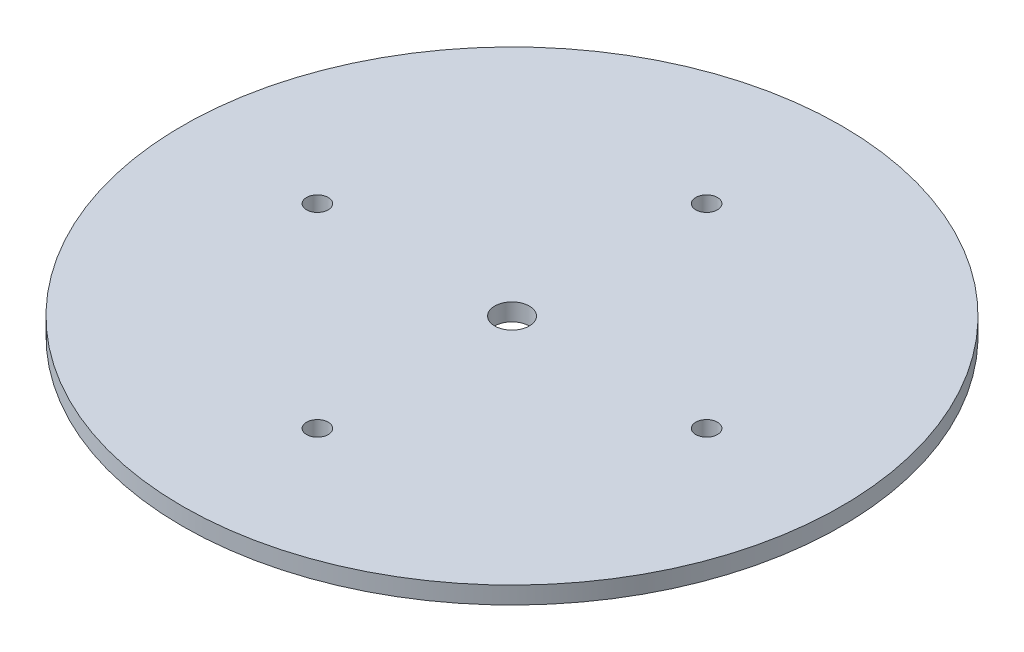
ISO-10303-21;
HEADER;
FILE_DESCRIPTION(('STEP AP214'),'2;1');
FILE_NAME('part.step','',(''),(''),'','','');
FILE_SCHEMA(('AUTOMOTIVE_DESIGN { 1 0 10303 214 1 1 1 1 }'));
ENDSEC;
DATA;
#1=APPLICATION_CONTEXT('core data for automotive mechanical design processes');
#2=APPLICATION_PROTOCOL_DEFINITION('international standard','automotive_design',2000,#1);
#3=PRODUCT_CONTEXT('',#1,'mechanical');
#4=PRODUCT('Part','Part','',(#3));
#5=PRODUCT_RELATED_PRODUCT_CATEGORY('part','',(#4));
#6=PRODUCT_DEFINITION_FORMATION('','',#4);
#7=PRODUCT_DEFINITION_CONTEXT('part definition',#1,'design');
#8=PRODUCT_DEFINITION('design','',#6,#7);
#9=PRODUCT_DEFINITION_SHAPE('','',#8);
#10=(LENGTH_UNIT() NAMED_UNIT(*) SI_UNIT(.MILLI.,.METRE.));
#11=(NAMED_UNIT(*) PLANE_ANGLE_UNIT() SI_UNIT($,.RADIAN.));
#12=(NAMED_UNIT(*) SI_UNIT($,.STERADIAN.) SOLID_ANGLE_UNIT());
#13=UNCERTAINTY_MEASURE_WITH_UNIT(LENGTH_MEASURE(1.E-05),#10,'distance_accuracy_value','');
#14=(GEOMETRIC_REPRESENTATION_CONTEXT(3) GLOBAL_UNCERTAINTY_ASSIGNED_CONTEXT((#13)) GLOBAL_UNIT_ASSIGNED_CONTEXT((#10,
#11,#12)) REPRESENTATION_CONTEXT('',''));
#15=CARTESIAN_POINT('',(0.,0.,0.));
#16=DIRECTION('',(0.,0.,1.));
#17=DIRECTION('',(1.,0.,0.));
#18=AXIS2_PLACEMENT_3D('',#15,#16,#17);
#19=CARTESIAN_POINT('',(0.,4.,45.));
#20=DIRECTION('',(0.,-1.,0.));
#21=DIRECTION('',(0.,0.,-1.));
#22=AXIS2_PLACEMENT_3D('',#19,#20,#21);
#23=CYLINDRICAL_SURFACE('',#22,2.5);
#24=CARTESIAN_POINT('',(0.,4.,45.));
#25=DIRECTION('',(0.,1.,0.));
#26=DIRECTION('',(0.,0.,1.));
#27=AXIS2_PLACEMENT_3D('',#24,#25,#26);
#28=CIRCLE('',#27,2.5);
#29=CARTESIAN_POINT('',(0.,4.,47.5));
#30=VERTEX_POINT('',#29);
#31=EDGE_CURVE('E43',#30,#30,#28,.T.);
#32=ORIENTED_EDGE('',*,*,#31,.T.);
#33=EDGE_LOOP('',(#32));
#34=FACE_BOUND('',#33,.T.);
#35=CARTESIAN_POINT('',(0.,0.,45.));
#36=DIRECTION('',(0.,1.,0.));
#37=DIRECTION('',(0.,0.,1.));
#38=AXIS2_PLACEMENT_3D('',#35,#36,#37);
#39=CIRCLE('',#38,2.5);
#40=CARTESIAN_POINT('',(0.,0.,47.5));
#41=VERTEX_POINT('',#40);
#42=EDGE_CURVE('E63',#41,#41,#39,.T.);
#43=ORIENTED_EDGE('',*,*,#42,.F.);
#44=EDGE_LOOP('',(#43));
#45=FACE_BOUND('',#44,.T.);
#46=ADVANCED_FACE('F35',(#34,#45),#23,.F.);
#47=CARTESIAN_POINT('',(0.,4.,0.));
#48=DIRECTION('',(0.,-1.,0.));
#49=DIRECTION('',(0.,0.,-1.));
#50=AXIS2_PLACEMENT_3D('',#47,#48,#49);
#51=CYLINDRICAL_SURFACE('',#50,4.);
#52=CARTESIAN_POINT('',(0.,4.,0.));
#53=DIRECTION('',(0.,1.,0.));
#54=DIRECTION('',(0.,0.,1.));
#55=AXIS2_PLACEMENT_3D('',#52,#53,#54);
#56=CIRCLE('',#55,4.);
#57=CARTESIAN_POINT('',(0.,4.,4.));
#58=VERTEX_POINT('',#57);
#59=EDGE_CURVE('E48',#58,#58,#56,.T.);
#60=ORIENTED_EDGE('',*,*,#59,.T.);
#61=EDGE_LOOP('',(#60));
#62=FACE_BOUND('',#61,.T.);
#63=CARTESIAN_POINT('',(0.,0.,0.));
#64=DIRECTION('',(0.,1.,0.));
#65=DIRECTION('',(0.,0.,1.));
#66=AXIS2_PLACEMENT_3D('',#63,#64,#65);
#67=CIRCLE('',#66,4.);
#68=CARTESIAN_POINT('',(0.,0.,4.));
#69=VERTEX_POINT('',#68);
#70=EDGE_CURVE('E61',#69,#69,#67,.T.);
#71=ORIENTED_EDGE('',*,*,#70,.F.);
#72=EDGE_LOOP('',(#71));
#73=FACE_BOUND('',#72,.T.);
#74=ADVANCED_FACE('F84',(#62,#73),#51,.F.);
#75=CARTESIAN_POINT('',(45.,4.,0.));
#76=DIRECTION('',(0.,-1.,0.));
#77=DIRECTION('',(0.,0.,-1.));
#78=AXIS2_PLACEMENT_3D('',#75,#76,#77);
#79=CYLINDRICAL_SURFACE('',#78,2.5);
#80=CARTESIAN_POINT('',(45.,4.,0.));
#81=DIRECTION('',(0.,1.,0.));
#82=DIRECTION('',(0.,0.,1.));
#83=AXIS2_PLACEMENT_3D('',#80,#81,#82);
#84=CIRCLE('',#83,2.5);
#85=CARTESIAN_POINT('',(45.,4.,2.49999999999999));
#86=VERTEX_POINT('',#85);
#87=EDGE_CURVE('E77',#86,#86,#84,.T.);
#88=ORIENTED_EDGE('',*,*,#87,.T.);
#89=EDGE_LOOP('',(#88));
#90=FACE_BOUND('',#89,.T.);
#91=CARTESIAN_POINT('',(45.,0.,0.));
#92=DIRECTION('',(0.,1.,0.));
#93=DIRECTION('',(0.,0.,1.));
#94=AXIS2_PLACEMENT_3D('',#91,#92,#93);
#95=CIRCLE('',#94,2.5);
#96=CARTESIAN_POINT('',(45.,0.,2.49999999999999));
#97=VERTEX_POINT('',#96);
#98=EDGE_CURVE('E58',#97,#97,#95,.T.);
#99=ORIENTED_EDGE('',*,*,#98,.F.);
#100=EDGE_LOOP('',(#99));
#101=FACE_BOUND('',#100,.T.);
#102=ADVANCED_FACE('F101',(#90,#101),#79,.F.);
#103=CARTESIAN_POINT('',(-45.,4.,0.));
#104=DIRECTION('',(0.,-1.,0.));
#105=DIRECTION('',(0.,0.,-1.));
#106=AXIS2_PLACEMENT_3D('',#103,#104,#105);
#107=CYLINDRICAL_SURFACE('',#106,2.5);
#108=CARTESIAN_POINT('',(-45.,4.,0.));
#109=DIRECTION('',(0.,1.,0.));
#110=DIRECTION('',(0.,0.,1.));
#111=AXIS2_PLACEMENT_3D('',#108,#109,#110);
#112=CIRCLE('',#111,2.5);
#113=CARTESIAN_POINT('',(-45.,4.,2.50000000000001));
#114=VERTEX_POINT('',#113);
#115=EDGE_CURVE('E72',#114,#114,#112,.T.);
#116=ORIENTED_EDGE('',*,*,#115,.T.);
#117=EDGE_LOOP('',(#116));
#118=FACE_BOUND('',#117,.T.);
#119=CARTESIAN_POINT('',(-45.,0.,0.));
#120=DIRECTION('',(0.,1.,0.));
#121=DIRECTION('',(0.,0.,1.));
#122=AXIS2_PLACEMENT_3D('',#119,#120,#121);
#123=CIRCLE('',#122,2.5);
#124=CARTESIAN_POINT('',(-45.,0.,2.50000000000001));
#125=VERTEX_POINT('',#124);
#126=EDGE_CURVE('E55',#125,#125,#123,.T.);
#127=ORIENTED_EDGE('',*,*,#126,.F.);
#128=EDGE_LOOP('',(#127));
#129=FACE_BOUND('',#128,.T.);
#130=ADVANCED_FACE('F107',(#118,#129),#107,.F.);
#131=CARTESIAN_POINT('',(0.,4.,0.));
#132=DIRECTION('',(0.,-1.,0.));
#133=DIRECTION('',(0.,0.,-1.));
#134=AXIS2_PLACEMENT_3D('',#131,#132,#133);
#135=CYLINDRICAL_SURFACE('',#134,76.2);
#136=CARTESIAN_POINT('',(0.,4.,0.));
#137=DIRECTION('',(0.,1.,0.));
#138=DIRECTION('',(0.,0.,1.));
#139=AXIS2_PLACEMENT_3D('',#136,#137,#138);
#140=CIRCLE('',#139,76.2);
#141=CARTESIAN_POINT('',(0.,4.,76.2));
#142=VERTEX_POINT('',#141);
#143=EDGE_CURVE('E68',#142,#142,#140,.T.);
#144=ORIENTED_EDGE('',*,*,#143,.F.);
#145=EDGE_LOOP('',(#144));
#146=FACE_BOUND('',#145,.T.);
#147=CARTESIAN_POINT('',(0.,0.,0.));
#148=DIRECTION('',(0.,1.,0.));
#149=DIRECTION('',(0.,0.,1.));
#150=AXIS2_PLACEMENT_3D('',#147,#148,#149);
#151=CIRCLE('',#150,76.2);
#152=CARTESIAN_POINT('',(0.,0.,76.2));
#153=VERTEX_POINT('',#152);
#154=EDGE_CURVE('E52',#153,#153,#151,.T.);
#155=ORIENTED_EDGE('',*,*,#154,.T.);
#156=EDGE_LOOP('',(#155));
#157=FACE_BOUND('',#156,.T.);
#158=ADVANCED_FACE('F37',(#146,#157),#135,.T.);
#159=CARTESIAN_POINT('',(0.,4.,-45.));
#160=DIRECTION('',(0.,-1.,0.));
#161=DIRECTION('',(0.,0.,-1.));
#162=AXIS2_PLACEMENT_3D('',#159,#160,#161);
#163=CYLINDRICAL_SURFACE('',#162,2.5);
#164=CARTESIAN_POINT('',(0.,4.,-45.));
#165=DIRECTION('',(0.,1.,0.));
#166=DIRECTION('',(0.,0.,1.));
#167=AXIS2_PLACEMENT_3D('',#164,#165,#166);
#168=CIRCLE('',#167,2.5);
#169=CARTESIAN_POINT('',(0.,4.,-42.5));
#170=VERTEX_POINT('',#169);
#171=EDGE_CURVE('E10',#170,#170,#168,.F.);
#172=ORIENTED_EDGE('',*,*,#171,.F.);
#173=EDGE_LOOP('',(#172));
#174=FACE_BOUND('',#173,.T.);
#175=CARTESIAN_POINT('',(0.,0.,-45.));
#176=DIRECTION('',(0.,1.,0.));
#177=DIRECTION('',(0.,0.,1.));
#178=AXIS2_PLACEMENT_3D('',#175,#176,#177);
#179=CIRCLE('',#178,2.5);
#180=CARTESIAN_POINT('',(0.,0.,-42.5));
#181=VERTEX_POINT('',#180);
#182=EDGE_CURVE('E39',#181,#181,#179,.F.);
#183=ORIENTED_EDGE('',*,*,#182,.T.);
#184=EDGE_LOOP('',(#183));
#185=FACE_BOUND('',#184,.T.);
#186=ADVANCED_FACE('F91',(#174,#185),#163,.F.);
#187=CARTESIAN_POINT('',(0.,4.,0.));
#188=DIRECTION('',(0.,1.,0.));
#189=DIRECTION('',(0.,0.,1.));
#190=AXIS2_PLACEMENT_3D('',#187,#188,#189);
#191=PLANE('',#190);
#192=ORIENTED_EDGE('',*,*,#143,.T.);
#193=EDGE_LOOP('',(#192));
#194=FACE_BOUND('',#193,.T.);
#195=ORIENTED_EDGE('',*,*,#115,.F.);
#196=EDGE_LOOP('',(#195));
#197=FACE_BOUND('',#196,.T.);
#198=ORIENTED_EDGE('',*,*,#87,.F.);
#199=EDGE_LOOP('',(#198));
#200=FACE_BOUND('',#199,.T.);
#201=ORIENTED_EDGE('',*,*,#59,.F.);
#202=EDGE_LOOP('',(#201));
#203=FACE_BOUND('',#202,.T.);
#204=ORIENTED_EDGE('',*,*,#31,.F.);
#205=EDGE_LOOP('',(#204));
#206=FACE_BOUND('',#205,.T.);
#207=ORIENTED_EDGE('',*,*,#171,.T.);
#208=EDGE_LOOP('',(#207));
#209=FACE_BOUND('',#208,.T.);
#210=ADVANCED_FACE('F87',(#194,#197,#200,#203,#206,#209),#191,.T.);
#211=CARTESIAN_POINT('',(0.,0.,0.));
#212=DIRECTION('',(0.,1.,0.));
#213=DIRECTION('',(0.,0.,1.));
#214=AXIS2_PLACEMENT_3D('',#211,#212,#213);
#215=PLANE('',#214);
#216=ORIENTED_EDGE('',*,*,#154,.F.);
#217=EDGE_LOOP('',(#216));
#218=FACE_BOUND('',#217,.T.);
#219=ORIENTED_EDGE('',*,*,#126,.T.);
#220=EDGE_LOOP('',(#219));
#221=FACE_BOUND('',#220,.T.);
#222=ORIENTED_EDGE('',*,*,#98,.T.);
#223=EDGE_LOOP('',(#222));
#224=FACE_BOUND('',#223,.T.);
#225=ORIENTED_EDGE('',*,*,#70,.T.);
#226=EDGE_LOOP('',(#225));
#227=FACE_BOUND('',#226,.T.);
#228=ORIENTED_EDGE('',*,*,#42,.T.);
#229=EDGE_LOOP('',(#228));
#230=FACE_BOUND('',#229,.T.);
#231=ORIENTED_EDGE('',*,*,#182,.F.);
#232=EDGE_LOOP('',(#231));
#233=FACE_BOUND('',#232,.T.);
#234=ADVANCED_FACE('F90',(#218,#221,#224,#227,#230,#233),#215,.F.);
#235=CLOSED_SHELL('',(#46,#74,#102,#130,#158,#186,#210,#234));
#236=MANIFOLD_SOLID_BREP('B2',#235);
#237=ADVANCED_BREP_SHAPE_REPRESENTATION('',(#18,#236),#14);
#238=SHAPE_DEFINITION_REPRESENTATION(#9,#237);
ENDSEC;
END-ISO-10303-21;
